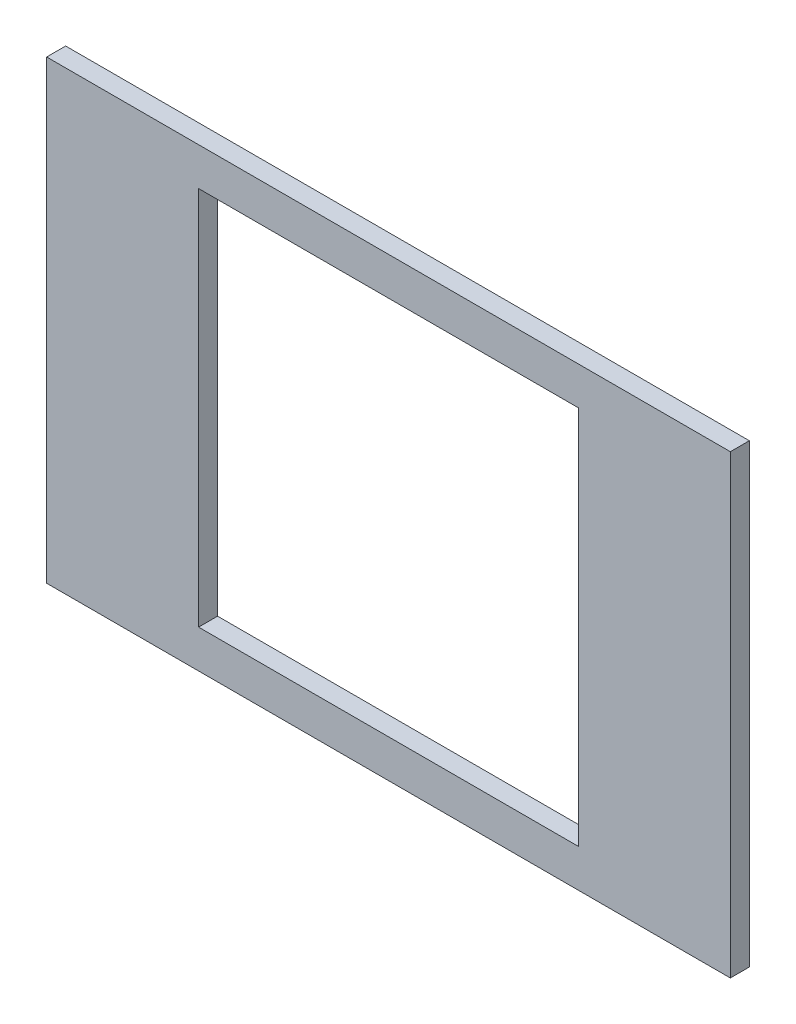
ISO-10303-21;
HEADER;
FILE_DESCRIPTION(('STEP AP214'),'2;1');
FILE_NAME('part.step','',(''),(''),'','','');
FILE_SCHEMA(('AUTOMOTIVE_DESIGN { 1 0 10303 214 1 1 1 1 }'));
ENDSEC;
DATA;
#1=APPLICATION_CONTEXT('core data for automotive mechanical design processes');
#2=APPLICATION_PROTOCOL_DEFINITION('international standard','automotive_design',2000,#1);
#3=PRODUCT_CONTEXT('',#1,'mechanical');
#4=PRODUCT('Part','Part','',(#3));
#5=PRODUCT_RELATED_PRODUCT_CATEGORY('part','',(#4));
#6=PRODUCT_DEFINITION_FORMATION('','',#4);
#7=PRODUCT_DEFINITION_CONTEXT('part definition',#1,'design');
#8=PRODUCT_DEFINITION('design','',#6,#7);
#9=PRODUCT_DEFINITION_SHAPE('','',#8);
#10=(LENGTH_UNIT() NAMED_UNIT(*) SI_UNIT(.MILLI.,.METRE.));
#11=(NAMED_UNIT(*) PLANE_ANGLE_UNIT() SI_UNIT($,.RADIAN.));
#12=(NAMED_UNIT(*) SI_UNIT($,.STERADIAN.) SOLID_ANGLE_UNIT());
#13=UNCERTAINTY_MEASURE_WITH_UNIT(LENGTH_MEASURE(1.E-05),#10,'distance_accuracy_value','');
#14=(GEOMETRIC_REPRESENTATION_CONTEXT(3) GLOBAL_UNCERTAINTY_ASSIGNED_CONTEXT((#13)) GLOBAL_UNIT_ASSIGNED_CONTEXT((#10,
#11,#12)) REPRESENTATION_CONTEXT('',''));
#15=CARTESIAN_POINT('',(0.,0.,0.));
#16=DIRECTION('',(0.,0.,1.));
#17=DIRECTION('',(1.,0.,0.));
#18=AXIS2_PLACEMENT_3D('',#15,#16,#17);
#19=CARTESIAN_POINT('',(228.6,152.4,12.7));
#20=DIRECTION('',(1.,0.,0.));
#21=DIRECTION('',(0.,1.,0.));
#22=AXIS2_PLACEMENT_3D('',#19,#20,#21);
#23=PLANE('',#22);
#24=DIRECTION('',(0.,-1.,0.));
#25=VECTOR('',#24,1.);
#26=CARTESIAN_POINT('',(228.6,152.4,0.));
#27=LINE('',#26,#25);
#28=CARTESIAN_POINT('',(228.6,152.4,0.));
#29=VERTEX_POINT('',#28);
#30=CARTESIAN_POINT('',(228.6,-152.4,0.));
#31=VERTEX_POINT('',#30);
#32=EDGE_CURVE('E129',#29,#31,#27,.T.);
#33=ORIENTED_EDGE('',*,*,#32,.F.);
#34=DIRECTION('',(0.,0.,-1.));
#35=VECTOR('',#34,1.);
#36=CARTESIAN_POINT('',(228.6,152.4,12.7));
#37=LINE('',#36,#35);
#38=CARTESIAN_POINT('',(228.6,152.4,12.7));
#39=VERTEX_POINT('',#38);
#40=EDGE_CURVE('E11',#39,#29,#37,.T.);
#41=ORIENTED_EDGE('',*,*,#40,.F.);
#42=DIRECTION('',(0.,-1.,0.));
#43=VECTOR('',#42,1.);
#44=CARTESIAN_POINT('',(228.6,152.4,12.7));
#45=LINE('',#44,#43);
#46=CARTESIAN_POINT('',(228.6,-152.4,12.7));
#47=VERTEX_POINT('',#46);
#48=EDGE_CURVE('E133',#39,#47,#45,.T.);
#49=ORIENTED_EDGE('',*,*,#48,.T.);
#50=DIRECTION('',(0.,0.,-1.));
#51=VECTOR('',#50,1.);
#52=CARTESIAN_POINT('',(228.6,-152.4,12.7));
#53=LINE('',#52,#51);
#54=EDGE_CURVE('E36',#47,#31,#53,.T.);
#55=ORIENTED_EDGE('',*,*,#54,.T.);
#56=EDGE_LOOP('',(#33,#41,#49,#55));
#57=FACE_BOUND('',#56,.T.);
#58=ADVANCED_FACE('F33',(#57),#23,.T.);
#59=CARTESIAN_POINT('',(228.6,152.4,12.7));
#60=DIRECTION('',(0.,-1.,0.));
#61=DIRECTION('',(1.,0.,0.));
#62=AXIS2_PLACEMENT_3D('',#59,#60,#61);
#63=PLANE('',#62);
#64=DIRECTION('',(-1.,0.,0.));
#65=VECTOR('',#64,1.);
#66=CARTESIAN_POINT('',(228.6,152.4,0.));
#67=LINE('',#66,#65);
#68=CARTESIAN_POINT('',(-228.6,152.4,0.));
#69=VERTEX_POINT('',#68);
#70=EDGE_CURVE('E137',#29,#69,#67,.T.);
#71=ORIENTED_EDGE('',*,*,#70,.T.);
#72=DIRECTION('',(0.,0.,-1.));
#73=VECTOR('',#72,1.);
#74=CARTESIAN_POINT('',(-228.6,152.4,12.7));
#75=LINE('',#74,#73);
#76=CARTESIAN_POINT('',(-228.6,152.4,12.7));
#77=VERTEX_POINT('',#76);
#78=EDGE_CURVE('E41',#77,#69,#75,.T.);
#79=ORIENTED_EDGE('',*,*,#78,.F.);
#80=DIRECTION('',(-1.,0.,0.));
#81=VECTOR('',#80,1.);
#82=CARTESIAN_POINT('',(228.6,152.4,12.7));
#83=LINE('',#82,#81);
#84=EDGE_CURVE('E142',#39,#77,#83,.T.);
#85=ORIENTED_EDGE('',*,*,#84,.F.);
#86=ORIENTED_EDGE('',*,*,#40,.T.);
#87=EDGE_LOOP('',(#71,#79,#85,#86));
#88=FACE_BOUND('',#87,.T.);
#89=ADVANCED_FACE('F167',(#88),#63,.F.);
#90=CARTESIAN_POINT('',(-228.6,152.4,12.7));
#91=DIRECTION('',(1.,0.,0.));
#92=DIRECTION('',(0.,1.,0.));
#93=AXIS2_PLACEMENT_3D('',#90,#91,#92);
#94=PLANE('',#93);
#95=DIRECTION('',(0.,-1.,0.));
#96=VECTOR('',#95,1.);
#97=CARTESIAN_POINT('',(-228.6,152.4,0.));
#98=LINE('',#97,#96);
#99=CARTESIAN_POINT('',(-228.6,-152.4,0.));
#100=VERTEX_POINT('',#99);
#101=EDGE_CURVE('E149',#69,#100,#98,.T.);
#102=ORIENTED_EDGE('',*,*,#101,.T.);
#103=DIRECTION('',(0.,0.,-1.));
#104=VECTOR('',#103,1.);
#105=CARTESIAN_POINT('',(-228.6,-152.4,12.7));
#106=LINE('',#105,#104);
#107=CARTESIAN_POINT('',(-228.6,-152.4,12.7));
#108=VERTEX_POINT('',#107);
#109=EDGE_CURVE('E154',#108,#100,#106,.T.);
#110=ORIENTED_EDGE('',*,*,#109,.F.);
#111=DIRECTION('',(0.,-1.,0.));
#112=VECTOR('',#111,1.);
#113=CARTESIAN_POINT('',(-228.6,152.4,12.7));
#114=LINE('',#113,#112);
#115=EDGE_CURVE('E140',#77,#108,#114,.T.);
#116=ORIENTED_EDGE('',*,*,#115,.F.);
#117=ORIENTED_EDGE('',*,*,#78,.T.);
#118=EDGE_LOOP('',(#102,#110,#116,#117));
#119=FACE_BOUND('',#118,.T.);
#120=ADVANCED_FACE('F171',(#119),#94,.F.);
#121=CARTESIAN_POINT('',(228.6,-152.4,12.7));
#122=DIRECTION('',(0.,-1.,0.));
#123=DIRECTION('',(1.,0.,0.));
#124=AXIS2_PLACEMENT_3D('',#121,#122,#123);
#125=PLANE('',#124);
#126=DIRECTION('',(-1.,0.,0.));
#127=VECTOR('',#126,1.);
#128=CARTESIAN_POINT('',(228.6,-152.4,0.));
#129=LINE('',#128,#127);
#130=EDGE_CURVE('E146',#31,#100,#129,.T.);
#131=ORIENTED_EDGE('',*,*,#130,.F.);
#132=ORIENTED_EDGE('',*,*,#54,.F.);
#133=DIRECTION('',(-1.,0.,0.));
#134=VECTOR('',#133,1.);
#135=CARTESIAN_POINT('',(228.6,-152.4,12.7));
#136=LINE('',#135,#134);
#137=EDGE_CURVE('E136',#47,#108,#136,.T.);
#138=ORIENTED_EDGE('',*,*,#137,.T.);
#139=ORIENTED_EDGE('',*,*,#109,.T.);
#140=EDGE_LOOP('',(#131,#132,#138,#139));
#141=FACE_BOUND('',#140,.T.);
#142=ADVANCED_FACE('F162',(#141),#125,.T.);
#143=CARTESIAN_POINT('',(0.,0.,12.7));
#144=DIRECTION('',(0.,0.,-1.));
#145=DIRECTION('',(-1.,0.,0.));
#146=AXIS2_PLACEMENT_3D('',#143,#144,#145);
#147=PLANE('',#146);
#148=DIRECTION('',(0.,-1.,0.));
#149=VECTOR('',#148,1.);
#150=CARTESIAN_POINT('',(-127.,0.,12.7));
#151=LINE('',#150,#149);
#152=CARTESIAN_POINT('',(-127.,127.,12.7));
#153=VERTEX_POINT('',#152);
#154=CARTESIAN_POINT('',(-127.,-127.,12.7));
#155=VERTEX_POINT('',#154);
#156=EDGE_CURVE('E123',#153,#155,#151,.T.);
#157=ORIENTED_EDGE('',*,*,#156,.F.);
#158=DIRECTION('',(-1.,0.,0.));
#159=VECTOR('',#158,1.);
#160=CARTESIAN_POINT('',(0.,127.,12.7));
#161=LINE('',#160,#159);
#162=CARTESIAN_POINT('',(127.,127.,12.7));
#163=VERTEX_POINT('',#162);
#164=EDGE_CURVE('E49',#163,#153,#161,.T.);
#165=ORIENTED_EDGE('',*,*,#164,.F.);
#166=DIRECTION('',(0.,-1.,0.));
#167=VECTOR('',#166,1.);
#168=CARTESIAN_POINT('',(127.,0.,12.7));
#169=LINE('',#168,#167);
#170=CARTESIAN_POINT('',(127.,-127.,12.7));
#171=VERTEX_POINT('',#170);
#172=EDGE_CURVE('E114',#163,#171,#169,.T.);
#173=ORIENTED_EDGE('',*,*,#172,.T.);
#174=DIRECTION('',(-1.,0.,0.));
#175=VECTOR('',#174,1.);
#176=CARTESIAN_POINT('',(1.11022302462516E-13,-127.,12.7));
#177=LINE('',#176,#175);
#178=EDGE_CURVE('E117',#171,#155,#177,.T.);
#179=ORIENTED_EDGE('',*,*,#178,.T.);
#180=EDGE_LOOP('',(#157,#165,#173,#179));
#181=FACE_BOUND('',#180,.T.);
#182=ORIENTED_EDGE('',*,*,#48,.F.);
#183=ORIENTED_EDGE('',*,*,#84,.T.);
#184=ORIENTED_EDGE('',*,*,#115,.T.);
#185=ORIENTED_EDGE('',*,*,#137,.F.);
#186=EDGE_LOOP('',(#182,#183,#184,#185));
#187=FACE_BOUND('',#186,.T.);
#188=ADVANCED_FACE('F173',(#181,#187),#147,.F.);
#189=CARTESIAN_POINT('',(0.,0.,0.));
#190=DIRECTION('',(0.,0.,-1.));
#191=DIRECTION('',(-1.,0.,0.));
#192=AXIS2_PLACEMENT_3D('',#189,#190,#191);
#193=PLANE('',#192);
#194=DIRECTION('',(-1.,0.,0.));
#195=VECTOR('',#194,1.);
#196=CARTESIAN_POINT('',(0.,127.,0.));
#197=LINE('',#196,#195);
#198=CARTESIAN_POINT('',(127.,127.,0.));
#199=VERTEX_POINT('',#198);
#200=CARTESIAN_POINT('',(-127.,127.,0.));
#201=VERTEX_POINT('',#200);
#202=EDGE_CURVE('E100',#199,#201,#197,.T.);
#203=ORIENTED_EDGE('',*,*,#202,.T.);
#204=DIRECTION('',(0.,-1.,0.));
#205=VECTOR('',#204,1.);
#206=CARTESIAN_POINT('',(-127.,0.,0.));
#207=LINE('',#206,#205);
#208=CARTESIAN_POINT('',(-127.,-127.,0.));
#209=VERTEX_POINT('',#208);
#210=EDGE_CURVE('E106',#201,#209,#207,.T.);
#211=ORIENTED_EDGE('',*,*,#210,.T.);
#212=DIRECTION('',(-1.,0.,0.));
#213=VECTOR('',#212,1.);
#214=CARTESIAN_POINT('',(1.11022302462516E-13,-127.,0.));
#215=LINE('',#214,#213);
#216=CARTESIAN_POINT('',(127.,-127.,0.));
#217=VERTEX_POINT('',#216);
#218=EDGE_CURVE('E110',#217,#209,#215,.T.);
#219=ORIENTED_EDGE('',*,*,#218,.F.);
#220=DIRECTION('',(0.,-1.,0.));
#221=VECTOR('',#220,1.);
#222=CARTESIAN_POINT('',(127.,0.,0.));
#223=LINE('',#222,#221);
#224=EDGE_CURVE('E103',#199,#217,#223,.T.);
#225=ORIENTED_EDGE('',*,*,#224,.F.);
#226=EDGE_LOOP('',(#203,#211,#219,#225));
#227=FACE_BOUND('',#226,.T.);
#228=ORIENTED_EDGE('',*,*,#32,.T.);
#229=ORIENTED_EDGE('',*,*,#130,.T.);
#230=ORIENTED_EDGE('',*,*,#101,.F.);
#231=ORIENTED_EDGE('',*,*,#70,.F.);
#232=EDGE_LOOP('',(#228,#229,#230,#231));
#233=FACE_BOUND('',#232,.T.);
#234=ADVANCED_FACE('F112',(#227,#233),#193,.T.);
#235=CARTESIAN_POINT('',(0.,127.,0.));
#236=DIRECTION('',(0.,1.,0.));
#237=DIRECTION('',(-1.,0.,0.));
#238=AXIS2_PLACEMENT_3D('',#235,#236,#237);
#239=PLANE('',#238);
#240=ORIENTED_EDGE('',*,*,#164,.T.);
#241=DIRECTION('',(0.,0.,1.));
#242=VECTOR('',#241,1.);
#243=CARTESIAN_POINT('',(-127.,127.,0.));
#244=LINE('',#243,#242);
#245=EDGE_CURVE('E97',#201,#153,#244,.T.);
#246=ORIENTED_EDGE('',*,*,#245,.F.);
#247=ORIENTED_EDGE('',*,*,#202,.F.);
#248=DIRECTION('',(0.,0.,1.));
#249=VECTOR('',#248,1.);
#250=CARTESIAN_POINT('',(127.,127.,0.));
#251=LINE('',#250,#249);
#252=EDGE_CURVE('E127',#199,#163,#251,.T.);
#253=ORIENTED_EDGE('',*,*,#252,.T.);
#254=EDGE_LOOP('',(#240,#246,#247,#253));
#255=FACE_BOUND('',#254,.T.);
#256=ADVANCED_FACE('F98',(#255),#239,.F.);
#257=CARTESIAN_POINT('',(127.,0.,0.));
#258=DIRECTION('',(-1.,0.,0.));
#259=DIRECTION('',(0.,-1.,0.));
#260=AXIS2_PLACEMENT_3D('',#257,#258,#259);
#261=PLANE('',#260);
#262=ORIENTED_EDGE('',*,*,#172,.F.);
#263=ORIENTED_EDGE('',*,*,#252,.F.);
#264=ORIENTED_EDGE('',*,*,#224,.T.);
#265=DIRECTION('',(0.,0.,1.));
#266=VECTOR('',#265,1.);
#267=CARTESIAN_POINT('',(127.,-127.,0.));
#268=LINE('',#267,#266);
#269=EDGE_CURVE('E130',#217,#171,#268,.T.);
#270=ORIENTED_EDGE('',*,*,#269,.T.);
#271=EDGE_LOOP('',(#262,#263,#264,#270));
#272=FACE_BOUND('',#271,.T.);
#273=ADVANCED_FACE('F217',(#272),#261,.T.);
#274=CARTESIAN_POINT('',(1.11022302462516E-13,-127.,0.));
#275=DIRECTION('',(0.,1.,0.));
#276=DIRECTION('',(-1.,0.,0.));
#277=AXIS2_PLACEMENT_3D('',#274,#275,#276);
#278=PLANE('',#277);
#279=ORIENTED_EDGE('',*,*,#178,.F.);
#280=ORIENTED_EDGE('',*,*,#269,.F.);
#281=ORIENTED_EDGE('',*,*,#218,.T.);
#282=DIRECTION('',(0.,0.,1.));
#283=VECTOR('',#282,1.);
#284=CARTESIAN_POINT('',(-127.,-127.,0.));
#285=LINE('',#284,#283);
#286=EDGE_CURVE('E57',#209,#155,#285,.T.);
#287=ORIENTED_EDGE('',*,*,#286,.T.);
#288=EDGE_LOOP('',(#279,#280,#281,#287));
#289=FACE_BOUND('',#288,.T.);
#290=ADVANCED_FACE('F225',(#289),#278,.T.);
#291=CARTESIAN_POINT('',(-127.,0.,0.));
#292=DIRECTION('',(-1.,0.,0.));
#293=DIRECTION('',(0.,-1.,0.));
#294=AXIS2_PLACEMENT_3D('',#291,#292,#293);
#295=PLANE('',#294);
#296=ORIENTED_EDGE('',*,*,#156,.T.);
#297=ORIENTED_EDGE('',*,*,#286,.F.);
#298=ORIENTED_EDGE('',*,*,#210,.F.);
#299=ORIENTED_EDGE('',*,*,#245,.T.);
#300=EDGE_LOOP('',(#296,#297,#298,#299));
#301=FACE_BOUND('',#300,.T.);
#302=ADVANCED_FACE('F107',(#301),#295,.F.);
#303=CLOSED_SHELL('',(#58,#89,#120,#142,#188,#234,#256,#273,#290,#302));
#304=MANIFOLD_SOLID_BREP('B2',#303);
#305=ADVANCED_BREP_SHAPE_REPRESENTATION('',(#18,#304),#14);
#306=SHAPE_DEFINITION_REPRESENTATION(#9,#305);
ENDSEC;
END-ISO-10303-21;
